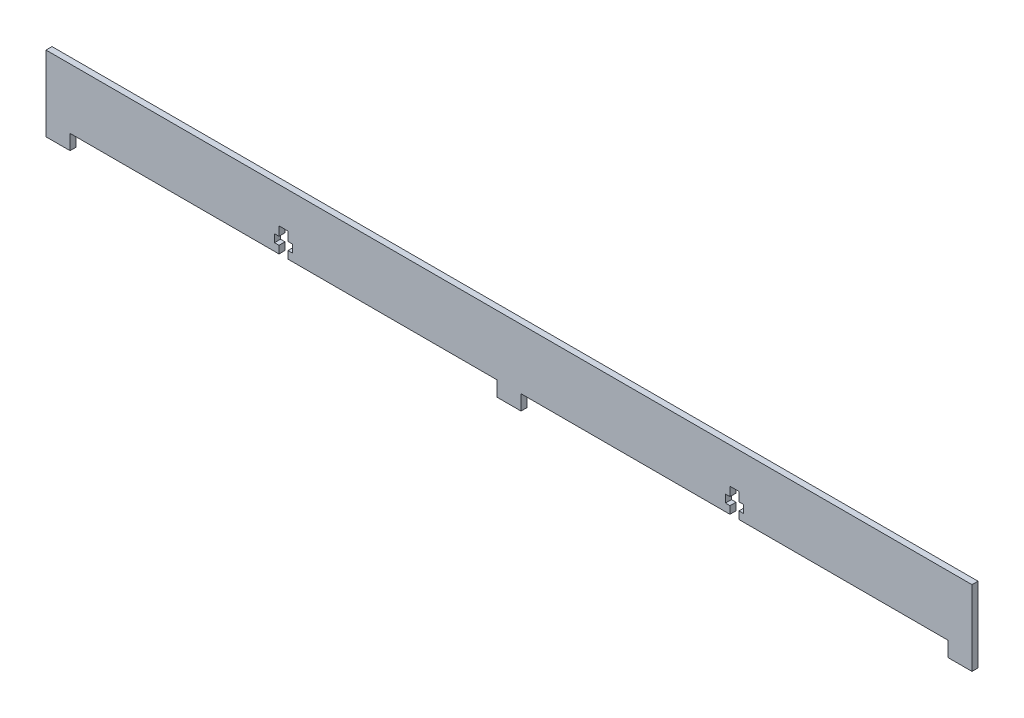
ISO-10303-21;
HEADER;
FILE_DESCRIPTION(('STEP AP214'),'2;1');
FILE_NAME('part.step','',(''),(''),'','','');
FILE_SCHEMA(('AUTOMOTIVE_DESIGN { 1 0 10303 214 1 1 1 1 }'));
ENDSEC;
DATA;
#1=APPLICATION_CONTEXT('core data for automotive mechanical design processes');
#2=APPLICATION_PROTOCOL_DEFINITION('international standard','automotive_design',2000,#1);
#3=PRODUCT_CONTEXT('',#1,'mechanical');
#4=PRODUCT('Part','Part','',(#3));
#5=PRODUCT_RELATED_PRODUCT_CATEGORY('part','',(#4));
#6=PRODUCT_DEFINITION_FORMATION('','',#4);
#7=PRODUCT_DEFINITION_CONTEXT('part definition',#1,'design');
#8=PRODUCT_DEFINITION('design','',#6,#7);
#9=PRODUCT_DEFINITION_SHAPE('','',#8);
#10=(LENGTH_UNIT() NAMED_UNIT(*) SI_UNIT(.MILLI.,.METRE.));
#11=(NAMED_UNIT(*) PLANE_ANGLE_UNIT() SI_UNIT($,.RADIAN.));
#12=(NAMED_UNIT(*) SI_UNIT($,.STERADIAN.) SOLID_ANGLE_UNIT());
#13=UNCERTAINTY_MEASURE_WITH_UNIT(LENGTH_MEASURE(1.E-05),#10,'distance_accuracy_value','');
#14=(GEOMETRIC_REPRESENTATION_CONTEXT(3) GLOBAL_UNCERTAINTY_ASSIGNED_CONTEXT((#13)) GLOBAL_UNIT_ASSIGNED_CONTEXT((#10,
#11,#12)) REPRESENTATION_CONTEXT('',''));
#15=CARTESIAN_POINT('',(0.,0.,0.));
#16=DIRECTION('',(0.,0.,1.));
#17=DIRECTION('',(1.,0.,0.));
#18=AXIS2_PLACEMENT_3D('',#15,#16,#17);
#19=CARTESIAN_POINT('',(1.50000000000004,0.,2.));
#20=DIRECTION('',(1.,0.,0.));
#21=DIRECTION('',(0.,1.,0.));
#22=AXIS2_PLACEMENT_3D('',#19,#20,#21);
#23=PLANE('',#22);
#24=DIRECTION('',(0.,-1.,0.));
#25=VECTOR('',#24,1.);
#26=CARTESIAN_POINT('',(1.50000000000004,0.,0.));
#27=LINE('',#26,#25);
#28=CARTESIAN_POINT('',(1.5,2.4999999999999,0.));
#29=VERTEX_POINT('',#28);
#30=CARTESIAN_POINT('',(1.50000000000004,-1.05818134681562E-13,0.));
#31=VERTEX_POINT('',#30);
#32=EDGE_CURVE('E300',#29,#31,#27,.T.);
#33=ORIENTED_EDGE('',*,*,#32,.T.);
#34=DIRECTION('',(0.,0.,-1.));
#35=VECTOR('',#34,1.);
#36=CARTESIAN_POINT('',(1.50000000000004,-1.05818134681562E-13,2.));
#37=LINE('',#36,#35);
#38=CARTESIAN_POINT('',(1.50000000000004,-1.05818134681562E-13,2.));
#39=VERTEX_POINT('',#38);
#40=EDGE_CURVE('E11',#39,#31,#37,.T.);
#41=ORIENTED_EDGE('',*,*,#40,.F.);
#42=DIRECTION('',(0.,-1.,0.));
#43=VECTOR('',#42,1.);
#44=CARTESIAN_POINT('',(1.50000000000004,0.,2.));
#45=LINE('',#44,#43);
#46=CARTESIAN_POINT('',(1.5,2.4999999999999,2.));
#47=VERTEX_POINT('',#46);
#48=EDGE_CURVE('E392',#47,#39,#45,.T.);
#49=ORIENTED_EDGE('',*,*,#48,.F.);
#50=DIRECTION('',(0.,0.,-1.));
#51=VECTOR('',#50,1.);
#52=CARTESIAN_POINT('',(1.5,2.4999999999999,2.));
#53=LINE('',#52,#51);
#54=EDGE_CURVE('E51',#47,#29,#53,.T.);
#55=ORIENTED_EDGE('',*,*,#54,.T.);
#56=EDGE_LOOP('',(#33,#41,#49,#55));
#57=FACE_BOUND('',#56,.T.);
#58=ADVANCED_FACE('F35',(#57),#23,.F.);
#59=CARTESIAN_POINT('',(0.,0.,2.));
#60=DIRECTION('',(0.,1.,0.));
#61=DIRECTION('',(-1.,0.,0.));
#62=AXIS2_PLACEMENT_3D('',#59,#60,#61);
#63=PLANE('',#62);
#64=DIRECTION('',(1.,0.,0.));
#65=VECTOR('',#64,1.);
#66=CARTESIAN_POINT('',(0.,0.,0.));
#67=LINE('',#66,#65);
#68=CARTESIAN_POINT('',(71.,0.,0.));
#69=VERTEX_POINT('',#68);
#70=EDGE_CURVE('E302',#31,#69,#67,.T.);
#71=ORIENTED_EDGE('',*,*,#70,.T.);
#72=DIRECTION('',(0.,0.,-1.));
#73=VECTOR('',#72,1.);
#74=CARTESIAN_POINT('',(71.,0.,2.));
#75=LINE('',#74,#73);
#76=CARTESIAN_POINT('',(71.,0.,2.));
#77=VERTEX_POINT('',#76);
#78=EDGE_CURVE('E43',#77,#69,#75,.T.);
#79=ORIENTED_EDGE('',*,*,#78,.F.);
#80=DIRECTION('',(1.,0.,0.));
#81=VECTOR('',#80,1.);
#82=CARTESIAN_POINT('',(0.,0.,2.));
#83=LINE('',#82,#81);
#84=EDGE_CURVE('E173',#39,#77,#83,.T.);
#85=ORIENTED_EDGE('',*,*,#84,.F.);
#86=ORIENTED_EDGE('',*,*,#40,.T.);
#87=EDGE_LOOP('',(#71,#79,#85,#86));
#88=FACE_BOUND('',#87,.T.);
#89=ADVANCED_FACE('F570',(#88),#63,.F.);
#90=CARTESIAN_POINT('',(71.,0.,2.));
#91=DIRECTION('',(1.,0.,0.));
#92=DIRECTION('',(0.,0.,-1.));
#93=AXIS2_PLACEMENT_3D('',#90,#91,#92);
#94=PLANE('',#93);
#95=DIRECTION('',(0.,-1.,0.));
#96=VECTOR('',#95,1.);
#97=CARTESIAN_POINT('',(71.,0.,0.));
#98=LINE('',#97,#96);
#99=CARTESIAN_POINT('',(71.,-5.00000000000001,0.));
#100=VERTEX_POINT('',#99);
#101=EDGE_CURVE('E304',#69,#100,#98,.T.);
#102=ORIENTED_EDGE('',*,*,#101,.T.);
#103=DIRECTION('',(0.,0.,-1.));
#104=VECTOR('',#103,1.);
#105=CARTESIAN_POINT('',(71.,-5.00000000000001,2.));
#106=LINE('',#105,#104);
#107=CARTESIAN_POINT('',(71.,-5.00000000000001,2.));
#108=VERTEX_POINT('',#107);
#109=EDGE_CURVE('E465',#108,#100,#106,.T.);
#110=ORIENTED_EDGE('',*,*,#109,.F.);
#111=DIRECTION('',(0.,-1.,0.));
#112=VECTOR('',#111,1.);
#113=CARTESIAN_POINT('',(71.,0.,2.));
#114=LINE('',#113,#112);
#115=EDGE_CURVE('E472',#77,#108,#114,.T.);
#116=ORIENTED_EDGE('',*,*,#115,.F.);
#117=ORIENTED_EDGE('',*,*,#78,.T.);
#118=EDGE_LOOP('',(#102,#110,#116,#117));
#119=FACE_BOUND('',#118,.T.);
#120=ADVANCED_FACE('F470',(#119),#94,.F.);
#121=CARTESIAN_POINT('',(0.,-5.00000000000001,2.));
#122=DIRECTION('',(0.,-1.,0.));
#123=DIRECTION('',(0.,0.,-1.));
#124=AXIS2_PLACEMENT_3D('',#121,#122,#123);
#125=PLANE('',#124);
#126=DIRECTION('',(-1.,0.,0.));
#127=VECTOR('',#126,1.);
#128=CARTESIAN_POINT('',(0.,-5.00000000000001,0.));
#129=LINE('',#128,#127);
#130=CARTESIAN_POINT('',(79.,-5.00000000000001,0.));
#131=VERTEX_POINT('',#130);
#132=EDGE_CURVE('E307',#131,#100,#129,.T.);
#133=ORIENTED_EDGE('',*,*,#132,.F.);
#134=DIRECTION('',(0.,0.,-1.));
#135=VECTOR('',#134,1.);
#136=CARTESIAN_POINT('',(79.,-5.00000000000001,2.));
#137=LINE('',#136,#135);
#138=CARTESIAN_POINT('',(79.,-5.00000000000001,2.));
#139=VERTEX_POINT('',#138);
#140=EDGE_CURVE('E463',#139,#131,#137,.T.);
#141=ORIENTED_EDGE('',*,*,#140,.F.);
#142=DIRECTION('',(-1.,0.,0.));
#143=VECTOR('',#142,1.);
#144=CARTESIAN_POINT('',(0.,-5.00000000000001,2.));
#145=LINE('',#144,#143);
#146=EDGE_CURVE('E483',#139,#108,#145,.T.);
#147=ORIENTED_EDGE('',*,*,#146,.T.);
#148=ORIENTED_EDGE('',*,*,#109,.T.);
#149=EDGE_LOOP('',(#133,#141,#147,#148));
#150=FACE_BOUND('',#149,.T.);
#151=ADVANCED_FACE('F479',(#150),#125,.T.);
#152=CARTESIAN_POINT('',(79.,0.,2.));
#153=DIRECTION('',(-1.,0.,0.));
#154=DIRECTION('',(0.,0.,1.));
#155=AXIS2_PLACEMENT_3D('',#152,#153,#154);
#156=PLANE('',#155);
#157=DIRECTION('',(0.,1.,0.));
#158=VECTOR('',#157,1.);
#159=CARTESIAN_POINT('',(79.,0.,0.));
#160=LINE('',#159,#158);
#161=CARTESIAN_POINT('',(79.,20.,0.));
#162=VERTEX_POINT('',#161);
#163=EDGE_CURVE('E310',#131,#162,#160,.T.);
#164=ORIENTED_EDGE('',*,*,#163,.T.);
#165=DIRECTION('',(0.,0.,-1.));
#166=VECTOR('',#165,1.);
#167=CARTESIAN_POINT('',(79.,20.,2.));
#168=LINE('',#167,#166);
#169=CARTESIAN_POINT('',(79.,20.,2.));
#170=VERTEX_POINT('',#169);
#171=EDGE_CURVE('E460',#170,#162,#168,.T.);
#172=ORIENTED_EDGE('',*,*,#171,.F.);
#173=DIRECTION('',(0.,1.,0.));
#174=VECTOR('',#173,1.);
#175=CARTESIAN_POINT('',(79.,0.,2.));
#176=LINE('',#175,#174);
#177=EDGE_CURVE('E484',#139,#170,#176,.T.);
#178=ORIENTED_EDGE('',*,*,#177,.F.);
#179=ORIENTED_EDGE('',*,*,#140,.T.);
#180=EDGE_LOOP('',(#164,#172,#178,#179));
#181=FACE_BOUND('',#180,.T.);
#182=ADVANCED_FACE('F583',(#181),#156,.F.);
#183=CARTESIAN_POINT('',(0.,20.,2.));
#184=DIRECTION('',(0.,-1.,0.));
#185=DIRECTION('',(0.,0.,-1.));
#186=AXIS2_PLACEMENT_3D('',#183,#184,#185);
#187=PLANE('',#186);
#188=DIRECTION('',(-1.,0.,0.));
#189=VECTOR('',#188,1.);
#190=CARTESIAN_POINT('',(0.,20.,0.));
#191=LINE('',#190,#189);
#192=CARTESIAN_POINT('',(-229.,20.,0.));
#193=VERTEX_POINT('',#192);
#194=EDGE_CURVE('E312',#162,#193,#191,.T.);
#195=ORIENTED_EDGE('',*,*,#194,.T.);
#196=DIRECTION('',(0.,0.,-1.));
#197=VECTOR('',#196,1.);
#198=CARTESIAN_POINT('',(-229.,20.,2.));
#199=LINE('',#198,#197);
#200=CARTESIAN_POINT('',(-229.,20.,2.));
#201=VERTEX_POINT('',#200);
#202=EDGE_CURVE('E458',#201,#193,#199,.T.);
#203=ORIENTED_EDGE('',*,*,#202,.F.);
#204=DIRECTION('',(-1.,0.,0.));
#205=VECTOR('',#204,1.);
#206=CARTESIAN_POINT('',(0.,20.,2.));
#207=LINE('',#206,#205);
#208=EDGE_CURVE('E486',#170,#201,#207,.T.);
#209=ORIENTED_EDGE('',*,*,#208,.F.);
#210=ORIENTED_EDGE('',*,*,#171,.T.);
#211=EDGE_LOOP('',(#195,#203,#209,#210));
#212=FACE_BOUND('',#211,.T.);
#213=ADVANCED_FACE('F586',(#212),#187,.F.);
#214=CARTESIAN_POINT('',(-229.,0.,2.));
#215=DIRECTION('',(-1.,0.,0.));
#216=DIRECTION('',(0.,0.,1.));
#217=AXIS2_PLACEMENT_3D('',#214,#215,#216);
#218=PLANE('',#217);
#219=DIRECTION('',(0.,1.,0.));
#220=VECTOR('',#219,1.);
#221=CARTESIAN_POINT('',(-229.,0.,0.));
#222=LINE('',#221,#220);
#223=CARTESIAN_POINT('',(-229.,-5.00000000000001,0.));
#224=VERTEX_POINT('',#223);
#225=EDGE_CURVE('E315',#224,#193,#222,.T.);
#226=ORIENTED_EDGE('',*,*,#225,.F.);
#227=DIRECTION('',(0.,0.,-1.));
#228=VECTOR('',#227,1.);
#229=CARTESIAN_POINT('',(-229.,-5.00000000000001,2.));
#230=LINE('',#229,#228);
#231=CARTESIAN_POINT('',(-229.,-5.00000000000001,2.));
#232=VERTEX_POINT('',#231);
#233=EDGE_CURVE('E456',#232,#224,#230,.T.);
#234=ORIENTED_EDGE('',*,*,#233,.F.);
#235=DIRECTION('',(0.,1.,0.));
#236=VECTOR('',#235,1.);
#237=CARTESIAN_POINT('',(-229.,0.,2.));
#238=LINE('',#237,#236);
#239=EDGE_CURVE('E492',#232,#201,#238,.T.);
#240=ORIENTED_EDGE('',*,*,#239,.T.);
#241=ORIENTED_EDGE('',*,*,#202,.T.);
#242=EDGE_LOOP('',(#226,#234,#240,#241));
#243=FACE_BOUND('',#242,.T.);
#244=ADVANCED_FACE('F590',(#243),#218,.T.);
#245=CARTESIAN_POINT('',(0.,-5.00000000000001,2.));
#246=DIRECTION('',(0.,1.,0.));
#247=DIRECTION('',(0.,0.,1.));
#248=AXIS2_PLACEMENT_3D('',#245,#246,#247);
#249=PLANE('',#248);
#250=DIRECTION('',(1.,0.,0.));
#251=VECTOR('',#250,1.);
#252=CARTESIAN_POINT('',(0.,-5.00000000000001,0.));
#253=LINE('',#252,#251);
#254=CARTESIAN_POINT('',(-221.,-5.00000000000001,0.));
#255=VERTEX_POINT('',#254);
#256=EDGE_CURVE('E318',#224,#255,#253,.T.);
#257=ORIENTED_EDGE('',*,*,#256,.T.);
#258=DIRECTION('',(0.,0.,-1.));
#259=VECTOR('',#258,1.);
#260=CARTESIAN_POINT('',(-221.,-5.00000000000001,2.));
#261=LINE('',#260,#259);
#262=CARTESIAN_POINT('',(-221.,-5.00000000000001,2.));
#263=VERTEX_POINT('',#262);
#264=EDGE_CURVE('E454',#263,#255,#261,.T.);
#265=ORIENTED_EDGE('',*,*,#264,.F.);
#266=DIRECTION('',(1.,0.,0.));
#267=VECTOR('',#266,1.);
#268=CARTESIAN_POINT('',(0.,-5.00000000000001,2.));
#269=LINE('',#268,#267);
#270=EDGE_CURVE('E495',#232,#263,#269,.T.);
#271=ORIENTED_EDGE('',*,*,#270,.F.);
#272=ORIENTED_EDGE('',*,*,#233,.T.);
#273=EDGE_LOOP('',(#257,#265,#271,#272));
#274=FACE_BOUND('',#273,.T.);
#275=ADVANCED_FACE('F594',(#274),#249,.F.);
#276=CARTESIAN_POINT('',(-221.,-1.22679644221079E-12,2.));
#277=DIRECTION('',(1.,0.,0.));
#278=DIRECTION('',(0.,1.,0.));
#279=AXIS2_PLACEMENT_3D('',#276,#277,#278);
#280=PLANE('',#279);
#281=DIRECTION('',(0.,-1.,0.));
#282=VECTOR('',#281,1.);
#283=CARTESIAN_POINT('',(-221.,-1.22679644221079E-12,0.));
#284=LINE('',#283,#282);
#285=CARTESIAN_POINT('',(-221.,0.,0.));
#286=VERTEX_POINT('',#285);
#287=EDGE_CURVE('E321',#286,#255,#284,.T.);
#288=ORIENTED_EDGE('',*,*,#287,.F.);
#289=DIRECTION('',(0.,0.,-1.));
#290=VECTOR('',#289,1.);
#291=CARTESIAN_POINT('',(-221.,0.,2.));
#292=LINE('',#291,#290);
#293=CARTESIAN_POINT('',(-221.,0.,2.));
#294=VERTEX_POINT('',#293);
#295=EDGE_CURVE('E452',#294,#286,#292,.T.);
#296=ORIENTED_EDGE('',*,*,#295,.F.);
#297=DIRECTION('',(0.,-1.,0.));
#298=VECTOR('',#297,1.);
#299=CARTESIAN_POINT('',(-221.,-1.22679644221079E-12,2.));
#300=LINE('',#299,#298);
#301=EDGE_CURVE('E497',#294,#263,#300,.T.);
#302=ORIENTED_EDGE('',*,*,#301,.T.);
#303=ORIENTED_EDGE('',*,*,#264,.T.);
#304=EDGE_LOOP('',(#288,#296,#302,#303));
#305=FACE_BOUND('',#304,.T.);
#306=ADVANCED_FACE('F598',(#305),#280,.T.);
#307=CARTESIAN_POINT('',(0.,0.,2.));
#308=DIRECTION('',(0.,-1.,0.));
#309=DIRECTION('',(1.,0.,0.));
#310=AXIS2_PLACEMENT_3D('',#307,#308,#309);
#311=PLANE('',#310);
#312=DIRECTION('',(-1.,0.,0.));
#313=VECTOR('',#312,1.);
#314=CARTESIAN_POINT('',(0.,0.,0.));
#315=LINE('',#314,#313);
#316=CARTESIAN_POINT('',(-151.5,3.18842173561048E-13,0.));
#317=VERTEX_POINT('',#316);
#318=EDGE_CURVE('E324',#317,#286,#315,.T.);
#319=ORIENTED_EDGE('',*,*,#318,.F.);
#320=DIRECTION('',(0.,0.,-1.));
#321=VECTOR('',#320,1.);
#322=CARTESIAN_POINT('',(-151.5,3.18842173561048E-13,2.));
#323=LINE('',#322,#321);
#324=CARTESIAN_POINT('',(-151.5,3.18842173561048E-13,2.));
#325=VERTEX_POINT('',#324);
#326=EDGE_CURVE('E450',#325,#317,#323,.T.);
#327=ORIENTED_EDGE('',*,*,#326,.F.);
#328=DIRECTION('',(-1.,0.,0.));
#329=VECTOR('',#328,1.);
#330=CARTESIAN_POINT('',(0.,0.,2.));
#331=LINE('',#330,#329);
#332=EDGE_CURVE('E500',#325,#294,#331,.T.);
#333=ORIENTED_EDGE('',*,*,#332,.T.);
#334=ORIENTED_EDGE('',*,*,#295,.T.);
#335=EDGE_LOOP('',(#319,#327,#333,#334));
#336=FACE_BOUND('',#335,.T.);
#337=ADVANCED_FACE('F602',(#336),#311,.T.);
#338=CARTESIAN_POINT('',(-151.5,0.,2.));
#339=DIRECTION('',(-1.,0.,0.));
#340=DIRECTION('',(0.,0.,1.));
#341=AXIS2_PLACEMENT_3D('',#338,#339,#340);
#342=PLANE('',#341);
#343=DIRECTION('',(0.,1.,0.));
#344=VECTOR('',#343,1.);
#345=CARTESIAN_POINT('',(-151.5,0.,0.));
#346=LINE('',#345,#344);
#347=CARTESIAN_POINT('',(-151.5,2.4999999999999,0.));
#348=VERTEX_POINT('',#347);
#349=EDGE_CURVE('E327',#317,#348,#346,.T.);
#350=ORIENTED_EDGE('',*,*,#349,.T.);
#351=DIRECTION('',(0.,0.,-1.));
#352=VECTOR('',#351,1.);
#353=CARTESIAN_POINT('',(-151.5,2.4999999999999,2.));
#354=LINE('',#353,#352);
#355=CARTESIAN_POINT('',(-151.5,2.4999999999999,2.));
#356=VERTEX_POINT('',#355);
#357=EDGE_CURVE('E447',#356,#348,#354,.T.);
#358=ORIENTED_EDGE('',*,*,#357,.F.);
#359=DIRECTION('',(0.,1.,0.));
#360=VECTOR('',#359,1.);
#361=CARTESIAN_POINT('',(-151.5,0.,2.));
#362=LINE('',#361,#360);
#363=EDGE_CURVE('E503',#325,#356,#362,.T.);
#364=ORIENTED_EDGE('',*,*,#363,.F.);
#365=ORIENTED_EDGE('',*,*,#326,.T.);
#366=EDGE_LOOP('',(#350,#358,#364,#365));
#367=FACE_BOUND('',#366,.T.);
#368=ADVANCED_FACE('F606',(#367),#342,.F.);
#369=CARTESIAN_POINT('',(0.,2.49999999999911,2.));
#370=DIRECTION('',(0.,-1.,0.));
#371=DIRECTION('',(1.,0.,0.));
#372=AXIS2_PLACEMENT_3D('',#369,#370,#371);
#373=PLANE('',#372);
#374=DIRECTION('',(-1.,0.,0.));
#375=VECTOR('',#374,1.);
#376=CARTESIAN_POINT('',(0.,2.49999999999911,0.));
#377=LINE('',#376,#375);
#378=CARTESIAN_POINT('',(-153.,2.4999999999999,0.));
#379=VERTEX_POINT('',#378);
#380=EDGE_CURVE('E329',#348,#379,#377,.T.);
#381=ORIENTED_EDGE('',*,*,#380,.T.);
#382=DIRECTION('',(0.,0.,-1.));
#383=VECTOR('',#382,1.);
#384=CARTESIAN_POINT('',(-153.,2.4999999999999,2.));
#385=LINE('',#384,#383);
#386=CARTESIAN_POINT('',(-153.,2.4999999999999,2.));
#387=VERTEX_POINT('',#386);
#388=EDGE_CURVE('E444',#387,#379,#385,.T.);
#389=ORIENTED_EDGE('',*,*,#388,.F.);
#390=DIRECTION('',(-1.,0.,0.));
#391=VECTOR('',#390,1.);
#392=CARTESIAN_POINT('',(0.,2.49999999999911,2.));
#393=LINE('',#392,#391);
#394=EDGE_CURVE('E505',#356,#387,#393,.T.);
#395=ORIENTED_EDGE('',*,*,#394,.F.);
#396=ORIENTED_EDGE('',*,*,#357,.T.);
#397=EDGE_LOOP('',(#381,#389,#395,#396));
#398=FACE_BOUND('',#397,.T.);
#399=ADVANCED_FACE('F610',(#398),#373,.F.);
#400=CARTESIAN_POINT('',(-153.,1.63330887276537E-12,2.));
#401=DIRECTION('',(-1.,0.,0.));
#402=DIRECTION('',(0.,-1.,0.));
#403=AXIS2_PLACEMENT_3D('',#400,#401,#402);
#404=PLANE('',#403);
#405=DIRECTION('',(0.,1.,0.));
#406=VECTOR('',#405,1.);
#407=CARTESIAN_POINT('',(-153.,1.63330887276537E-12,0.));
#408=LINE('',#407,#406);
#409=CARTESIAN_POINT('',(-153.,5.10000000000068,0.));
#410=VERTEX_POINT('',#409);
#411=EDGE_CURVE('E331',#379,#410,#408,.T.);
#412=ORIENTED_EDGE('',*,*,#411,.T.);
#413=DIRECTION('',(0.,0.,-1.));
#414=VECTOR('',#413,1.);
#415=CARTESIAN_POINT('',(-153.,5.10000000000068,2.));
#416=LINE('',#415,#414);
#417=CARTESIAN_POINT('',(-153.,5.10000000000068,2.));
#418=VERTEX_POINT('',#417);
#419=EDGE_CURVE('E441',#418,#410,#416,.T.);
#420=ORIENTED_EDGE('',*,*,#419,.F.);
#421=DIRECTION('',(0.,1.,0.));
#422=VECTOR('',#421,1.);
#423=CARTESIAN_POINT('',(-153.,1.63330887276537E-12,2.));
#424=LINE('',#423,#422);
#425=EDGE_CURVE('E507',#387,#418,#424,.T.);
#426=ORIENTED_EDGE('',*,*,#425,.F.);
#427=ORIENTED_EDGE('',*,*,#388,.T.);
#428=EDGE_LOOP('',(#412,#420,#426,#427));
#429=FACE_BOUND('',#428,.T.);
#430=ADVANCED_FACE('F614',(#429),#404,.F.);
#431=CARTESIAN_POINT('',(0.,5.0999999999998,2.));
#432=DIRECTION('',(0.,1.,0.));
#433=DIRECTION('',(-1.,0.,0.));
#434=AXIS2_PLACEMENT_3D('',#431,#432,#433);
#435=PLANE('',#434);
#436=DIRECTION('',(1.,0.,0.));
#437=VECTOR('',#436,1.);
#438=CARTESIAN_POINT('',(0.,5.0999999999998,0.));
#439=LINE('',#438,#437);
#440=CARTESIAN_POINT('',(-151.499999999986,5.10000000000067,0.));
#441=VERTEX_POINT('',#440);
#442=EDGE_CURVE('E333',#410,#441,#439,.T.);
#443=ORIENTED_EDGE('',*,*,#442,.T.);
#444=DIRECTION('',(0.,0.,-1.));
#445=VECTOR('',#444,1.);
#446=CARTESIAN_POINT('',(-151.499999999986,5.10000000000067,2.));
#447=LINE('',#446,#445);
#448=CARTESIAN_POINT('',(-151.499999999986,5.10000000000067,2.));
#449=VERTEX_POINT('',#448);
#450=EDGE_CURVE('E438',#449,#441,#447,.T.);
#451=ORIENTED_EDGE('',*,*,#450,.F.);
#452=DIRECTION('',(1.,0.,0.));
#453=VECTOR('',#452,1.);
#454=CARTESIAN_POINT('',(0.,5.0999999999998,2.));
#455=LINE('',#454,#453);
#456=EDGE_CURVE('E509',#418,#449,#455,.T.);
#457=ORIENTED_EDGE('',*,*,#456,.F.);
#458=ORIENTED_EDGE('',*,*,#419,.T.);
#459=EDGE_LOOP('',(#443,#451,#457,#458));
#460=FACE_BOUND('',#459,.T.);
#461=ADVANCED_FACE('F618',(#460),#435,.F.);
#462=CARTESIAN_POINT('',(-151.499999999986,1.40165656858931E-12,2.));
#463=DIRECTION('',(-1.,0.,0.));
#464=DIRECTION('',(0.,-1.,0.));
#465=AXIS2_PLACEMENT_3D('',#462,#463,#464);
#466=PLANE('',#465);
#467=DIRECTION('',(0.,1.,0.));
#468=VECTOR('',#467,1.);
#469=CARTESIAN_POINT('',(-151.499999999986,1.40165656858931E-12,0.));
#470=LINE('',#469,#468);
#471=CARTESIAN_POINT('',(-151.499999999986,8.10000000000027,0.));
#472=VERTEX_POINT('',#471);
#473=EDGE_CURVE('E335',#441,#472,#470,.T.);
#474=ORIENTED_EDGE('',*,*,#473,.T.);
#475=DIRECTION('',(0.,0.,-1.));
#476=VECTOR('',#475,1.);
#477=CARTESIAN_POINT('',(-151.499999999986,8.10000000000027,2.));
#478=LINE('',#477,#476);
#479=CARTESIAN_POINT('',(-151.499999999986,8.10000000000027,2.));
#480=VERTEX_POINT('',#479);
#481=EDGE_CURVE('E435',#480,#472,#478,.T.);
#482=ORIENTED_EDGE('',*,*,#481,.F.);
#483=DIRECTION('',(0.,1.,0.));
#484=VECTOR('',#483,1.);
#485=CARTESIAN_POINT('',(-151.499999999986,1.40165656858931E-12,2.));
#486=LINE('',#485,#484);
#487=EDGE_CURVE('E511',#449,#480,#486,.T.);
#488=ORIENTED_EDGE('',*,*,#487,.F.);
#489=ORIENTED_EDGE('',*,*,#450,.T.);
#490=EDGE_LOOP('',(#474,#482,#488,#489));
#491=FACE_BOUND('',#490,.T.);
#492=ADVANCED_FACE('F622',(#491),#466,.F.);
#493=CARTESIAN_POINT('',(0.,8.09999999999958,2.));
#494=DIRECTION('',(0.,1.,0.));
#495=DIRECTION('',(-1.,0.,0.));
#496=AXIS2_PLACEMENT_3D('',#493,#494,#495);
#497=PLANE('',#496);
#498=DIRECTION('',(1.,0.,0.));
#499=VECTOR('',#498,1.);
#500=CARTESIAN_POINT('',(0.,8.09999999999958,0.));
#501=LINE('',#500,#499);
#502=CARTESIAN_POINT('',(-148.500000000014,8.10000000000026,0.));
#503=VERTEX_POINT('',#502);
#504=EDGE_CURVE('E337',#472,#503,#501,.T.);
#505=ORIENTED_EDGE('',*,*,#504,.T.);
#506=DIRECTION('',(0.,0.,-1.));
#507=VECTOR('',#506,1.);
#508=CARTESIAN_POINT('',(-148.500000000014,8.10000000000026,2.));
#509=LINE('',#508,#507);
#510=CARTESIAN_POINT('',(-148.500000000014,8.10000000000026,2.));
#511=VERTEX_POINT('',#510);
#512=EDGE_CURVE('E433',#511,#503,#509,.T.);
#513=ORIENTED_EDGE('',*,*,#512,.F.);
#514=DIRECTION('',(1.,0.,0.));
#515=VECTOR('',#514,1.);
#516=CARTESIAN_POINT('',(0.,8.09999999999958,2.));
#517=LINE('',#516,#515);
#518=EDGE_CURVE('E513',#480,#511,#517,.T.);
#519=ORIENTED_EDGE('',*,*,#518,.F.);
#520=ORIENTED_EDGE('',*,*,#481,.T.);
#521=EDGE_LOOP('',(#505,#513,#519,#520));
#522=FACE_BOUND('',#521,.T.);
#523=ADVANCED_FACE('F626',(#522),#497,.F.);
#524=CARTESIAN_POINT('',(-148.500000000014,1.37390099297353E-12,2.));
#525=DIRECTION('',(-1.,0.,0.));
#526=DIRECTION('',(0.,-1.,0.));
#527=AXIS2_PLACEMENT_3D('',#524,#525,#526);
#528=PLANE('',#527);
#529=DIRECTION('',(0.,1.,0.));
#530=VECTOR('',#529,1.);
#531=CARTESIAN_POINT('',(-148.500000000014,1.37390099297353E-12,0.));
#532=LINE('',#531,#530);
#533=CARTESIAN_POINT('',(-148.500000000014,5.09999999999977,0.));
#534=VERTEX_POINT('',#533);
#535=EDGE_CURVE('E340',#534,#503,#532,.T.);
#536=ORIENTED_EDGE('',*,*,#535,.F.);
#537=DIRECTION('',(0.,0.,-1.));
#538=VECTOR('',#537,1.);
#539=CARTESIAN_POINT('',(-148.500000000014,5.09999999999977,2.));
#540=LINE('',#539,#538);
#541=CARTESIAN_POINT('',(-148.500000000014,5.09999999999977,2.));
#542=VERTEX_POINT('',#541);
#543=EDGE_CURVE('E431',#542,#534,#540,.T.);
#544=ORIENTED_EDGE('',*,*,#543,.F.);
#545=DIRECTION('',(0.,1.,0.));
#546=VECTOR('',#545,1.);
#547=CARTESIAN_POINT('',(-148.500000000014,1.37390099297353E-12,2.));
#548=LINE('',#547,#546);
#549=EDGE_CURVE('E515',#542,#511,#548,.T.);
#550=ORIENTED_EDGE('',*,*,#549,.T.);
#551=ORIENTED_EDGE('',*,*,#512,.T.);
#552=EDGE_LOOP('',(#536,#544,#550,#551));
#553=FACE_BOUND('',#552,.T.);
#554=ADVANCED_FACE('F630',(#553),#528,.T.);
#555=CARTESIAN_POINT('',(0.,5.09999999999891,2.));
#556=DIRECTION('',(0.,-1.,0.));
#557=DIRECTION('',(1.,0.,0.));
#558=AXIS2_PLACEMENT_3D('',#555,#556,#557);
#559=PLANE('',#558);
#560=DIRECTION('',(-1.,0.,0.));
#561=VECTOR('',#560,1.);
#562=CARTESIAN_POINT('',(0.,5.09999999999891,0.));
#563=LINE('',#562,#561);
#564=CARTESIAN_POINT('',(-147.,5.09999999999976,0.));
#565=VERTEX_POINT('',#564);
#566=EDGE_CURVE('E343',#565,#534,#563,.T.);
#567=ORIENTED_EDGE('',*,*,#566,.F.);
#568=DIRECTION('',(0.,0.,-1.));
#569=VECTOR('',#568,1.);
#570=CARTESIAN_POINT('',(-147.,5.09999999999976,2.));
#571=LINE('',#570,#569);
#572=CARTESIAN_POINT('',(-147.,5.09999999999976,2.));
#573=VERTEX_POINT('',#572);
#574=EDGE_CURVE('E429',#573,#565,#571,.T.);
#575=ORIENTED_EDGE('',*,*,#574,.F.);
#576=DIRECTION('',(-1.,0.,0.));
#577=VECTOR('',#576,1.);
#578=CARTESIAN_POINT('',(0.,5.09999999999891,2.));
#579=LINE('',#578,#577);
#580=EDGE_CURVE('E518',#573,#542,#579,.T.);
#581=ORIENTED_EDGE('',*,*,#580,.T.);
#582=ORIENTED_EDGE('',*,*,#543,.T.);
#583=EDGE_LOOP('',(#567,#575,#581,#582));
#584=FACE_BOUND('',#583,.T.);
#585=ADVANCED_FACE('F634',(#584),#559,.T.);
#586=CARTESIAN_POINT('',(-147.,3.13851508884448E-12,2.));
#587=DIRECTION('',(-1.,0.,0.));
#588=DIRECTION('',(0.,-1.,0.));
#589=AXIS2_PLACEMENT_3D('',#586,#587,#588);
#590=PLANE('',#589);
#591=DIRECTION('',(0.,1.,0.));
#592=VECTOR('',#591,1.);
#593=CARTESIAN_POINT('',(-147.,3.13851508884448E-12,0.));
#594=LINE('',#593,#592);
#595=CARTESIAN_POINT('',(-147.,2.49999999999999,0.));
#596=VERTEX_POINT('',#595);
#597=EDGE_CURVE('E346',#596,#565,#594,.T.);
#598=ORIENTED_EDGE('',*,*,#597,.F.);
#599=DIRECTION('',(0.,0.,-1.));
#600=VECTOR('',#599,1.);
#601=CARTESIAN_POINT('',(-147.,2.49999999999999,2.));
#602=LINE('',#601,#600);
#603=CARTESIAN_POINT('',(-147.,2.49999999999999,2.));
#604=VERTEX_POINT('',#603);
#605=EDGE_CURVE('E427',#604,#596,#602,.T.);
#606=ORIENTED_EDGE('',*,*,#605,.F.);
#607=DIRECTION('',(0.,1.,0.));
#608=VECTOR('',#607,1.);
#609=CARTESIAN_POINT('',(-147.,3.13851508884448E-12,2.));
#610=LINE('',#609,#608);
#611=EDGE_CURVE('E521',#604,#573,#610,.T.);
#612=ORIENTED_EDGE('',*,*,#611,.T.);
#613=ORIENTED_EDGE('',*,*,#574,.T.);
#614=EDGE_LOOP('',(#598,#606,#612,#613));
#615=FACE_BOUND('',#614,.T.);
#616=ADVANCED_FACE('F638',(#615),#590,.T.);
#617=CARTESIAN_POINT('',(0.,2.49999999999871,2.));
#618=DIRECTION('',(0.,1.,0.));
#619=DIRECTION('',(-1.,0.,0.));
#620=AXIS2_PLACEMENT_3D('',#617,#618,#619);
#621=PLANE('',#620);
#622=DIRECTION('',(1.,0.,0.));
#623=VECTOR('',#622,1.);
#624=CARTESIAN_POINT('',(0.,2.49999999999871,0.));
#625=LINE('',#624,#623);
#626=CARTESIAN_POINT('',(-148.5,2.5,0.));
#627=VERTEX_POINT('',#626);
#628=EDGE_CURVE('E349',#627,#596,#625,.T.);
#629=ORIENTED_EDGE('',*,*,#628,.F.);
#630=DIRECTION('',(0.,0.,-1.));
#631=VECTOR('',#630,1.);
#632=CARTESIAN_POINT('',(-148.5,2.5,2.));
#633=LINE('',#632,#631);
#634=CARTESIAN_POINT('',(-148.5,2.5,2.));
#635=VERTEX_POINT('',#634);
#636=EDGE_CURVE('E425',#635,#627,#633,.T.);
#637=ORIENTED_EDGE('',*,*,#636,.F.);
#638=DIRECTION('',(1.,0.,0.));
#639=VECTOR('',#638,1.);
#640=CARTESIAN_POINT('',(0.,2.49999999999871,2.));
#641=LINE('',#640,#639);
#642=EDGE_CURVE('E524',#635,#604,#641,.T.);
#643=ORIENTED_EDGE('',*,*,#642,.T.);
#644=ORIENTED_EDGE('',*,*,#605,.T.);
#645=EDGE_LOOP('',(#629,#637,#643,#644));
#646=FACE_BOUND('',#645,.T.);
#647=ADVANCED_FACE('F642',(#646),#621,.T.);
#648=CARTESIAN_POINT('',(-148.5,0.,2.));
#649=DIRECTION('',(1.,0.,0.));
#650=DIRECTION('',(0.,0.,-1.));
#651=AXIS2_PLACEMENT_3D('',#648,#649,#650);
#652=PLANE('',#651);
#653=DIRECTION('',(0.,-1.,0.));
#654=VECTOR('',#653,1.);
#655=CARTESIAN_POINT('',(-148.5,0.,0.));
#656=LINE('',#655,#654);
#657=CARTESIAN_POINT('',(-148.5,6.03799833872494E-13,0.));
#658=VERTEX_POINT('',#657);
#659=EDGE_CURVE('E352',#627,#658,#656,.T.);
#660=ORIENTED_EDGE('',*,*,#659,.T.);
#661=DIRECTION('',(0.,0.,-1.));
#662=VECTOR('',#661,1.);
#663=CARTESIAN_POINT('',(-148.5,6.03799833872494E-13,2.));
#664=LINE('',#663,#662);
#665=CARTESIAN_POINT('',(-148.5,6.03799833872494E-13,2.));
#666=VERTEX_POINT('',#665);
#667=EDGE_CURVE('E422',#666,#658,#664,.T.);
#668=ORIENTED_EDGE('',*,*,#667,.F.);
#669=DIRECTION('',(0.,-1.,0.));
#670=VECTOR('',#669,1.);
#671=CARTESIAN_POINT('',(-148.5,0.,2.));
#672=LINE('',#671,#670);
#673=EDGE_CURVE('E527',#635,#666,#672,.T.);
#674=ORIENTED_EDGE('',*,*,#673,.F.);
#675=ORIENTED_EDGE('',*,*,#636,.T.);
#676=EDGE_LOOP('',(#660,#668,#674,#675));
#677=FACE_BOUND('',#676,.T.);
#678=ADVANCED_FACE('F646',(#677),#652,.F.);
#679=CARTESIAN_POINT('',(0.,0.,2.));
#680=DIRECTION('',(0.,1.,0.));
#681=DIRECTION('',(-1.,0.,0.));
#682=AXIS2_PLACEMENT_3D('',#679,#680,#681);
#683=PLANE('',#682);
#684=DIRECTION('',(1.,0.,0.));
#685=VECTOR('',#684,1.);
#686=CARTESIAN_POINT('',(0.,0.,0.));
#687=LINE('',#686,#685);
#688=CARTESIAN_POINT('',(-79.,3.21213379635872E-13,0.));
#689=VERTEX_POINT('',#688);
#690=EDGE_CURVE('E354',#658,#689,#687,.T.);
#691=ORIENTED_EDGE('',*,*,#690,.T.);
#692=DIRECTION('',(0.,0.,-1.));
#693=VECTOR('',#692,1.);
#694=CARTESIAN_POINT('',(-79.,3.21213379635872E-13,2.));
#695=LINE('',#694,#693);
#696=CARTESIAN_POINT('',(-79.,3.21213379635872E-13,2.));
#697=VERTEX_POINT('',#696);
#698=EDGE_CURVE('E419',#697,#689,#695,.T.);
#699=ORIENTED_EDGE('',*,*,#698,.F.);
#700=DIRECTION('',(1.,0.,0.));
#701=VECTOR('',#700,1.);
#702=CARTESIAN_POINT('',(0.,0.,2.));
#703=LINE('',#702,#701);
#704=EDGE_CURVE('E529',#666,#697,#703,.T.);
#705=ORIENTED_EDGE('',*,*,#704,.F.);
#706=ORIENTED_EDGE('',*,*,#667,.T.);
#707=EDGE_LOOP('',(#691,#699,#705,#706));
#708=FACE_BOUND('',#707,.T.);
#709=ADVANCED_FACE('F650',(#708),#683,.F.);
#710=CARTESIAN_POINT('',(-79.,2.19269047363467E-13,2.));
#711=DIRECTION('',(1.,0.,0.));
#712=DIRECTION('',(0.,1.,0.));
#713=AXIS2_PLACEMENT_3D('',#710,#711,#712);
#714=PLANE('',#713);
#715=DIRECTION('',(0.,-1.,0.));
#716=VECTOR('',#715,1.);
#717=CARTESIAN_POINT('',(-79.,2.19269047363467E-13,0.));
#718=LINE('',#717,#716);
#719=CARTESIAN_POINT('',(-79.,-5.00000000000001,0.));
#720=VERTEX_POINT('',#719);
#721=EDGE_CURVE('E356',#689,#720,#718,.T.);
#722=ORIENTED_EDGE('',*,*,#721,.T.);
#723=DIRECTION('',(0.,0.,-1.));
#724=VECTOR('',#723,1.);
#725=CARTESIAN_POINT('',(-79.,-5.00000000000001,2.));
#726=LINE('',#725,#724);
#727=CARTESIAN_POINT('',(-79.,-5.00000000000001,2.));
#728=VERTEX_POINT('',#727);
#729=EDGE_CURVE('E417',#728,#720,#726,.T.);
#730=ORIENTED_EDGE('',*,*,#729,.F.);
#731=DIRECTION('',(0.,-1.,0.));
#732=VECTOR('',#731,1.);
#733=CARTESIAN_POINT('',(-79.,2.19269047363467E-13,2.));
#734=LINE('',#733,#732);
#735=EDGE_CURVE('E531',#697,#728,#734,.T.);
#736=ORIENTED_EDGE('',*,*,#735,.F.);
#737=ORIENTED_EDGE('',*,*,#698,.T.);
#738=EDGE_LOOP('',(#722,#730,#736,#737));
#739=FACE_BOUND('',#738,.T.);
#740=ADVANCED_FACE('F654',(#739),#714,.F.);
#741=CARTESIAN_POINT('',(0.,-5.00000000000001,2.));
#742=DIRECTION('',(0.,-1.,0.));
#743=DIRECTION('',(0.,0.,-1.));
#744=AXIS2_PLACEMENT_3D('',#741,#742,#743);
#745=PLANE('',#744);
#746=DIRECTION('',(-1.,0.,0.));
#747=VECTOR('',#746,1.);
#748=CARTESIAN_POINT('',(0.,-5.00000000000001,0.));
#749=LINE('',#748,#747);
#750=CARTESIAN_POINT('',(-71.,-5.00000000000001,0.));
#751=VERTEX_POINT('',#750);
#752=EDGE_CURVE('E359',#751,#720,#749,.T.);
#753=ORIENTED_EDGE('',*,*,#752,.F.);
#754=DIRECTION('',(0.,0.,-1.));
#755=VECTOR('',#754,1.);
#756=CARTESIAN_POINT('',(-71.,-5.00000000000001,2.));
#757=LINE('',#756,#755);
#758=CARTESIAN_POINT('',(-71.,-5.00000000000001,2.));
#759=VERTEX_POINT('',#758);
#760=EDGE_CURVE('E415',#759,#751,#757,.T.);
#761=ORIENTED_EDGE('',*,*,#760,.F.);
#762=DIRECTION('',(-1.,0.,0.));
#763=VECTOR('',#762,1.);
#764=CARTESIAN_POINT('',(0.,-5.00000000000001,2.));
#765=LINE('',#764,#763);
#766=EDGE_CURVE('E533',#759,#728,#765,.T.);
#767=ORIENTED_EDGE('',*,*,#766,.T.);
#768=ORIENTED_EDGE('',*,*,#729,.T.);
#769=EDGE_LOOP('',(#753,#761,#767,#768));
#770=FACE_BOUND('',#769,.T.);
#771=ADVANCED_FACE('F658',(#770),#745,.T.);
#772=CARTESIAN_POINT('',(-71.,0.,2.));
#773=DIRECTION('',(1.,0.,0.));
#774=DIRECTION('',(0.,0.,-1.));
#775=AXIS2_PLACEMENT_3D('',#772,#773,#774);
#776=PLANE('',#775);
#777=DIRECTION('',(0.,-1.,0.));
#778=VECTOR('',#777,1.);
#779=CARTESIAN_POINT('',(-71.,0.,0.));
#780=LINE('',#779,#778);
#781=CARTESIAN_POINT('',(-71.,0.,0.));
#782=VERTEX_POINT('',#781);
#783=EDGE_CURVE('E362',#782,#751,#780,.T.);
#784=ORIENTED_EDGE('',*,*,#783,.F.);
#785=DIRECTION('',(0.,0.,-1.));
#786=VECTOR('',#785,1.);
#787=CARTESIAN_POINT('',(-71.,0.,2.));
#788=LINE('',#787,#786);
#789=CARTESIAN_POINT('',(-71.,0.,2.));
#790=VERTEX_POINT('',#789);
#791=EDGE_CURVE('E413',#790,#782,#788,.T.);
#792=ORIENTED_EDGE('',*,*,#791,.F.);
#793=DIRECTION('',(0.,-1.,0.));
#794=VECTOR('',#793,1.);
#795=CARTESIAN_POINT('',(-71.,0.,2.));
#796=LINE('',#795,#794);
#797=EDGE_CURVE('E536',#790,#759,#796,.T.);
#798=ORIENTED_EDGE('',*,*,#797,.T.);
#799=ORIENTED_EDGE('',*,*,#760,.T.);
#800=EDGE_LOOP('',(#784,#792,#798,#799));
#801=FACE_BOUND('',#800,.T.);
#802=ADVANCED_FACE('F662',(#801),#776,.T.);
#803=CARTESIAN_POINT('',(0.,0.,2.));
#804=DIRECTION('',(0.,-1.,0.));
#805=DIRECTION('',(1.,0.,0.));
#806=AXIS2_PLACEMENT_3D('',#803,#804,#805);
#807=PLANE('',#806);
#808=DIRECTION('',(-1.,0.,0.));
#809=VECTOR('',#808,1.);
#810=CARTESIAN_POINT('',(0.,0.,0.));
#811=LINE('',#810,#809);
#812=CARTESIAN_POINT('',(-1.50000000000003,0.,0.));
#813=VERTEX_POINT('',#812);
#814=EDGE_CURVE('E365',#813,#782,#811,.T.);
#815=ORIENTED_EDGE('',*,*,#814,.F.);
#816=DIRECTION('',(0.,0.,-1.));
#817=VECTOR('',#816,1.);
#818=CARTESIAN_POINT('',(-1.50000000000003,0.,2.));
#819=LINE('',#818,#817);
#820=CARTESIAN_POINT('',(-1.50000000000003,0.,2.));
#821=VERTEX_POINT('',#820);
#822=EDGE_CURVE('E411',#821,#813,#819,.T.);
#823=ORIENTED_EDGE('',*,*,#822,.F.);
#824=DIRECTION('',(-1.,0.,0.));
#825=VECTOR('',#824,1.);
#826=CARTESIAN_POINT('',(0.,0.,2.));
#827=LINE('',#826,#825);
#828=EDGE_CURVE('E539',#821,#790,#827,.T.);
#829=ORIENTED_EDGE('',*,*,#828,.T.);
#830=ORIENTED_EDGE('',*,*,#791,.T.);
#831=EDGE_LOOP('',(#815,#823,#829,#830));
#832=FACE_BOUND('',#831,.T.);
#833=ADVANCED_FACE('F666',(#832),#807,.T.);
#834=CARTESIAN_POINT('',(-1.50000000000003,0.,2.));
#835=DIRECTION('',(1.,0.,0.));
#836=DIRECTION('',(0.,1.,0.));
#837=AXIS2_PLACEMENT_3D('',#834,#835,#836);
#838=PLANE('',#837);
#839=DIRECTION('',(0.,-1.,0.));
#840=VECTOR('',#839,1.);
#841=CARTESIAN_POINT('',(-1.50000000000003,0.,0.));
#842=LINE('',#841,#840);
#843=CARTESIAN_POINT('',(-1.50000000000006,2.5,0.));
#844=VERTEX_POINT('',#843);
#845=EDGE_CURVE('E368',#844,#813,#842,.T.);
#846=ORIENTED_EDGE('',*,*,#845,.F.);
#847=DIRECTION('',(0.,0.,-1.));
#848=VECTOR('',#847,1.);
#849=CARTESIAN_POINT('',(-1.50000000000006,2.5,2.));
#850=LINE('',#849,#848);
#851=CARTESIAN_POINT('',(-1.50000000000006,2.5,2.));
#852=VERTEX_POINT('',#851);
#853=EDGE_CURVE('E409',#852,#844,#850,.T.);
#854=ORIENTED_EDGE('',*,*,#853,.F.);
#855=DIRECTION('',(0.,-1.,0.));
#856=VECTOR('',#855,1.);
#857=CARTESIAN_POINT('',(-1.50000000000003,0.,2.));
#858=LINE('',#857,#856);
#859=EDGE_CURVE('E542',#852,#821,#858,.T.);
#860=ORIENTED_EDGE('',*,*,#859,.T.);
#861=ORIENTED_EDGE('',*,*,#822,.T.);
#862=EDGE_LOOP('',(#846,#854,#860,#861));
#863=FACE_BOUND('',#862,.T.);
#864=ADVANCED_FACE('F670',(#863),#838,.T.);
#865=CARTESIAN_POINT('',(0.,2.50000000000002,2.));
#866=DIRECTION('',(0.,-1.,0.));
#867=DIRECTION('',(1.,0.,0.));
#868=AXIS2_PLACEMENT_3D('',#865,#866,#867);
#869=PLANE('',#868);
#870=DIRECTION('',(-1.,0.,0.));
#871=VECTOR('',#870,1.);
#872=CARTESIAN_POINT('',(0.,2.50000000000002,0.));
#873=LINE('',#872,#871);
#874=CARTESIAN_POINT('',(-2.99999999999973,2.49999999999999,0.));
#875=VERTEX_POINT('',#874);
#876=EDGE_CURVE('E371',#844,#875,#873,.T.);
#877=ORIENTED_EDGE('',*,*,#876,.T.);
#878=DIRECTION('',(0.,0.,-1.));
#879=VECTOR('',#878,1.);
#880=CARTESIAN_POINT('',(-2.99999999999973,2.49999999999999,2.));
#881=LINE('',#880,#879);
#882=CARTESIAN_POINT('',(-2.99999999999973,2.49999999999999,2.));
#883=VERTEX_POINT('',#882);
#884=EDGE_CURVE('E406',#883,#875,#881,.T.);
#885=ORIENTED_EDGE('',*,*,#884,.F.);
#886=DIRECTION('',(-1.,0.,0.));
#887=VECTOR('',#886,1.);
#888=CARTESIAN_POINT('',(0.,2.50000000000002,2.));
#889=LINE('',#888,#887);
#890=EDGE_CURVE('E545',#852,#883,#889,.T.);
#891=ORIENTED_EDGE('',*,*,#890,.F.);
#892=ORIENTED_EDGE('',*,*,#853,.T.);
#893=EDGE_LOOP('',(#877,#885,#891,#892));
#894=FACE_BOUND('',#893,.T.);
#895=ADVANCED_FACE('F674',(#894),#869,.F.);
#896=CARTESIAN_POINT('',(-2.99999999999967,0.,2.));
#897=DIRECTION('',(-1.,0.,0.));
#898=DIRECTION('',(0.,-1.,0.));
#899=AXIS2_PLACEMENT_3D('',#896,#897,#898);
#900=PLANE('',#899);
#901=DIRECTION('',(0.,1.,0.));
#902=VECTOR('',#901,1.);
#903=CARTESIAN_POINT('',(-2.99999999999967,0.,0.));
#904=LINE('',#903,#902);
#905=CARTESIAN_POINT('',(-2.99999999999978,5.09999999999976,0.));
#906=VERTEX_POINT('',#905);
#907=EDGE_CURVE('E373',#875,#906,#904,.T.);
#908=ORIENTED_EDGE('',*,*,#907,.T.);
#909=DIRECTION('',(0.,0.,-1.));
#910=VECTOR('',#909,1.);
#911=CARTESIAN_POINT('',(-2.99999999999978,5.09999999999976,2.));
#912=LINE('',#911,#910);
#913=CARTESIAN_POINT('',(-2.99999999999978,5.09999999999976,2.));
#914=VERTEX_POINT('',#913);
#915=EDGE_CURVE('E403',#914,#906,#912,.T.);
#916=ORIENTED_EDGE('',*,*,#915,.F.);
#917=DIRECTION('',(0.,1.,0.));
#918=VECTOR('',#917,1.);
#919=CARTESIAN_POINT('',(-2.99999999999967,0.,2.));
#920=LINE('',#919,#918);
#921=EDGE_CURVE('E547',#883,#914,#920,.T.);
#922=ORIENTED_EDGE('',*,*,#921,.F.);
#923=ORIENTED_EDGE('',*,*,#884,.T.);
#924=EDGE_LOOP('',(#908,#916,#922,#923));
#925=FACE_BOUND('',#924,.T.);
#926=ADVANCED_FACE('F678',(#925),#900,.F.);
#927=CARTESIAN_POINT('',(0.,5.09999999999977,2.));
#928=DIRECTION('',(0.,1.,0.));
#929=DIRECTION('',(-1.,0.,0.));
#930=AXIS2_PLACEMENT_3D('',#927,#928,#929);
#931=PLANE('',#930);
#932=DIRECTION('',(1.,0.,0.));
#933=VECTOR('',#932,1.);
#934=CARTESIAN_POINT('',(0.,5.09999999999977,0.));
#935=LINE('',#934,#933);
#936=CARTESIAN_POINT('',(-1.49999999998598,5.09999999999977,0.));
#937=VERTEX_POINT('',#936);
#938=EDGE_CURVE('E375',#906,#937,#935,.T.);
#939=ORIENTED_EDGE('',*,*,#938,.T.);
#940=DIRECTION('',(0.,0.,-1.));
#941=VECTOR('',#940,1.);
#942=CARTESIAN_POINT('',(-1.49999999998598,5.09999999999977,2.));
#943=LINE('',#942,#941);
#944=CARTESIAN_POINT('',(-1.49999999998598,5.09999999999977,2.));
#945=VERTEX_POINT('',#944);
#946=EDGE_CURVE('E400',#945,#937,#943,.T.);
#947=ORIENTED_EDGE('',*,*,#946,.F.);
#948=DIRECTION('',(1.,0.,0.));
#949=VECTOR('',#948,1.);
#950=CARTESIAN_POINT('',(0.,5.09999999999977,2.));
#951=LINE('',#950,#949);
#952=EDGE_CURVE('E549',#914,#945,#951,.T.);
#953=ORIENTED_EDGE('',*,*,#952,.F.);
#954=ORIENTED_EDGE('',*,*,#915,.T.);
#955=EDGE_LOOP('',(#939,#947,#953,#954));
#956=FACE_BOUND('',#955,.T.);
#957=ADVANCED_FACE('F682',(#956),#931,.F.);
#958=CARTESIAN_POINT('',(-1.49999999998594,0.,2.));
#959=DIRECTION('',(-1.,0.,0.));
#960=DIRECTION('',(0.,-1.,0.));
#961=AXIS2_PLACEMENT_3D('',#958,#959,#960);
#962=PLANE('',#961);
#963=DIRECTION('',(0.,1.,0.));
#964=VECTOR('',#963,1.);
#965=CARTESIAN_POINT('',(-1.49999999998594,0.,0.));
#966=LINE('',#965,#964);
#967=CARTESIAN_POINT('',(-1.49999999998601,8.10000000000026,0.));
#968=VERTEX_POINT('',#967);
#969=EDGE_CURVE('E377',#937,#968,#966,.T.);
#970=ORIENTED_EDGE('',*,*,#969,.T.);
#971=DIRECTION('',(0.,0.,-1.));
#972=VECTOR('',#971,1.);
#973=CARTESIAN_POINT('',(-1.49999999998601,8.10000000000026,2.));
#974=LINE('',#973,#972);
#975=CARTESIAN_POINT('',(-1.49999999998601,8.10000000000026,2.));
#976=VERTEX_POINT('',#975);
#977=EDGE_CURVE('E398',#976,#968,#974,.T.);
#978=ORIENTED_EDGE('',*,*,#977,.F.);
#979=DIRECTION('',(0.,1.,0.));
#980=VECTOR('',#979,1.);
#981=CARTESIAN_POINT('',(-1.49999999998594,0.,2.));
#982=LINE('',#981,#980);
#983=EDGE_CURVE('E551',#945,#976,#982,.T.);
#984=ORIENTED_EDGE('',*,*,#983,.F.);
#985=ORIENTED_EDGE('',*,*,#946,.T.);
#986=EDGE_LOOP('',(#970,#978,#984,#985));
#987=FACE_BOUND('',#986,.T.);
#988=ADVANCED_FACE('F686',(#987),#962,.F.);
#989=CARTESIAN_POINT('',(0.,8.10000000000027,2.));
#990=DIRECTION('',(0.,-1.,0.));
#991=DIRECTION('',(1.,0.,0.));
#992=AXIS2_PLACEMENT_3D('',#989,#990,#991);
#993=PLANE('',#992);
#994=DIRECTION('',(-1.,0.,0.));
#995=VECTOR('',#994,1.);
#996=CARTESIAN_POINT('',(0.,8.10000000000027,0.));
#997=LINE('',#996,#995);
#998=CARTESIAN_POINT('',(1.49999999998568,8.10000000000027,0.));
#999=VERTEX_POINT('',#998);
#1000=EDGE_CURVE('E380',#999,#968,#997,.T.);
#1001=ORIENTED_EDGE('',*,*,#1000,.F.);
#1002=DIRECTION('',(0.,0.,-1.));
#1003=VECTOR('',#1002,1.);
#1004=CARTESIAN_POINT('',(1.49999999998568,8.10000000000027,2.));
#1005=LINE('',#1004,#1003);
#1006=CARTESIAN_POINT('',(1.49999999998568,8.10000000000027,2.));
#1007=VERTEX_POINT('',#1006);
#1008=EDGE_CURVE('E396',#1007,#999,#1005,.T.);
#1009=ORIENTED_EDGE('',*,*,#1008,.F.);
#1010=DIRECTION('',(-1.,0.,0.));
#1011=VECTOR('',#1010,1.);
#1012=CARTESIAN_POINT('',(0.,8.10000000000027,2.));
#1013=LINE('',#1012,#1011);
#1014=EDGE_CURVE('E553',#1007,#976,#1013,.T.);
#1015=ORIENTED_EDGE('',*,*,#1014,.T.);
#1016=ORIENTED_EDGE('',*,*,#977,.T.);
#1017=EDGE_LOOP('',(#1001,#1009,#1015,#1016));
#1018=FACE_BOUND('',#1017,.T.);
#1019=ADVANCED_FACE('F690',(#1018),#993,.T.);
#1020=CARTESIAN_POINT('',(1.49999999998575,0.,2.));
#1021=DIRECTION('',(-1.,0.,0.));
#1022=DIRECTION('',(0.,-1.,0.));
#1023=AXIS2_PLACEMENT_3D('',#1020,#1021,#1022);
#1024=PLANE('',#1023);
#1025=DIRECTION('',(0.,1.,0.));
#1026=VECTOR('',#1025,1.);
#1027=CARTESIAN_POINT('',(1.49999999998575,0.,0.));
#1028=LINE('',#1027,#1026);
#1029=CARTESIAN_POINT('',(1.49999999998571,5.10000000000067,0.));
#1030=VERTEX_POINT('',#1029);
#1031=EDGE_CURVE('E383',#1030,#999,#1028,.T.);
#1032=ORIENTED_EDGE('',*,*,#1031,.F.);
#1033=DIRECTION('',(0.,0.,-1.));
#1034=VECTOR('',#1033,1.);
#1035=CARTESIAN_POINT('',(1.49999999998571,5.10000000000067,2.));
#1036=LINE('',#1035,#1034);
#1037=CARTESIAN_POINT('',(1.49999999998571,5.10000000000067,2.));
#1038=VERTEX_POINT('',#1037);
#1039=EDGE_CURVE('E282',#1038,#1030,#1036,.T.);
#1040=ORIENTED_EDGE('',*,*,#1039,.F.);
#1041=DIRECTION('',(0.,1.,0.));
#1042=VECTOR('',#1041,1.);
#1043=CARTESIAN_POINT('',(1.49999999998575,0.,2.));
#1044=LINE('',#1043,#1042);
#1045=EDGE_CURVE('E292',#1038,#1007,#1044,.T.);
#1046=ORIENTED_EDGE('',*,*,#1045,.T.);
#1047=ORIENTED_EDGE('',*,*,#1008,.T.);
#1048=EDGE_LOOP('',(#1032,#1040,#1046,#1047));
#1049=FACE_BOUND('',#1048,.T.);
#1050=ADVANCED_FACE('F557',(#1049),#1024,.T.);
#1051=CARTESIAN_POINT('',(0.,5.10000000000066,2.));
#1052=DIRECTION('',(0.,-1.,0.));
#1053=DIRECTION('',(1.,0.,0.));
#1054=AXIS2_PLACEMENT_3D('',#1051,#1052,#1053);
#1055=PLANE('',#1054);
#1056=DIRECTION('',(-1.,0.,0.));
#1057=VECTOR('',#1056,1.);
#1058=CARTESIAN_POINT('',(0.,5.10000000000066,0.));
#1059=LINE('',#1058,#1057);
#1060=CARTESIAN_POINT('',(2.99999999999992,5.10000000000068,0.));
#1061=VERTEX_POINT('',#1060);
#1062=EDGE_CURVE('E278',#1061,#1030,#1059,.T.);
#1063=ORIENTED_EDGE('',*,*,#1062,.F.);
#1064=DIRECTION('',(0.,0.,-1.));
#1065=VECTOR('',#1064,1.);
#1066=CARTESIAN_POINT('',(2.99999999999992,5.10000000000068,2.));
#1067=LINE('',#1066,#1065);
#1068=CARTESIAN_POINT('',(2.99999999999992,5.10000000000068,2.));
#1069=VERTEX_POINT('',#1068);
#1070=EDGE_CURVE('E273',#1069,#1061,#1067,.T.);
#1071=ORIENTED_EDGE('',*,*,#1070,.F.);
#1072=DIRECTION('',(-1.,0.,0.));
#1073=VECTOR('',#1072,1.);
#1074=CARTESIAN_POINT('',(0.,5.10000000000066,2.));
#1075=LINE('',#1074,#1073);
#1076=EDGE_CURVE('E276',#1069,#1038,#1075,.T.);
#1077=ORIENTED_EDGE('',*,*,#1076,.T.);
#1078=ORIENTED_EDGE('',*,*,#1039,.T.);
#1079=EDGE_LOOP('',(#1063,#1071,#1077,#1078));
#1080=FACE_BOUND('',#1079,.T.);
#1081=ADVANCED_FACE('F275',(#1080),#1055,.T.);
#1082=CARTESIAN_POINT('',(2.99999999999997,0.,2.));
#1083=DIRECTION('',(-1.,0.,0.));
#1084=DIRECTION('',(0.,-1.,0.));
#1085=AXIS2_PLACEMENT_3D('',#1082,#1083,#1084);
#1086=PLANE('',#1085);
#1087=DIRECTION('',(0.,1.,0.));
#1088=VECTOR('',#1087,1.);
#1089=CARTESIAN_POINT('',(2.99999999999997,0.,0.));
#1090=LINE('',#1089,#1088);
#1091=CARTESIAN_POINT('',(2.99999999999995,2.4999999999999,0.));
#1092=VERTEX_POINT('',#1091);
#1093=EDGE_CURVE('E387',#1092,#1061,#1090,.T.);
#1094=ORIENTED_EDGE('',*,*,#1093,.F.);
#1095=DIRECTION('',(0.,0.,-1.));
#1096=VECTOR('',#1095,1.);
#1097=CARTESIAN_POINT('',(2.99999999999995,2.4999999999999,2.));
#1098=LINE('',#1097,#1096);
#1099=CARTESIAN_POINT('',(2.99999999999995,2.4999999999999,2.));
#1100=VERTEX_POINT('',#1099);
#1101=EDGE_CURVE('E161',#1100,#1092,#1098,.T.);
#1102=ORIENTED_EDGE('',*,*,#1101,.F.);
#1103=DIRECTION('',(0.,1.,0.));
#1104=VECTOR('',#1103,1.);
#1105=CARTESIAN_POINT('',(2.99999999999997,0.,2.));
#1106=LINE('',#1105,#1104);
#1107=EDGE_CURVE('E289',#1100,#1069,#1106,.T.);
#1108=ORIENTED_EDGE('',*,*,#1107,.T.);
#1109=ORIENTED_EDGE('',*,*,#1070,.T.);
#1110=EDGE_LOOP('',(#1094,#1102,#1108,#1109));
#1111=FACE_BOUND('',#1110,.T.);
#1112=ADVANCED_FACE('F294',(#1111),#1086,.T.);
#1113=CARTESIAN_POINT('',(0.,2.49999999999989,2.));
#1114=DIRECTION('',(0.,1.,0.));
#1115=DIRECTION('',(-1.,0.,0.));
#1116=AXIS2_PLACEMENT_3D('',#1113,#1114,#1115);
#1117=PLANE('',#1116);
#1118=DIRECTION('',(1.,0.,0.));
#1119=VECTOR('',#1118,1.);
#1120=CARTESIAN_POINT('',(0.,2.49999999999989,0.));
#1121=LINE('',#1120,#1119);
#1122=EDGE_CURVE('E389',#29,#1092,#1121,.T.);
#1123=ORIENTED_EDGE('',*,*,#1122,.F.);
#1124=ORIENTED_EDGE('',*,*,#54,.F.);
#1125=DIRECTION('',(1.,0.,0.));
#1126=VECTOR('',#1125,1.);
#1127=CARTESIAN_POINT('',(0.,2.49999999999989,2.));
#1128=LINE('',#1127,#1126);
#1129=EDGE_CURVE('E295',#47,#1100,#1128,.T.);
#1130=ORIENTED_EDGE('',*,*,#1129,.T.);
#1131=ORIENTED_EDGE('',*,*,#1101,.T.);
#1132=EDGE_LOOP('',(#1123,#1124,#1130,#1131));
#1133=FACE_BOUND('',#1132,.T.);
#1134=ADVANCED_FACE('F559',(#1133),#1117,.T.);
#1135=CARTESIAN_POINT('',(0.,0.,2.));
#1136=DIRECTION('',(0.,0.,1.));
#1137=DIRECTION('',(1.,0.,0.));
#1138=AXIS2_PLACEMENT_3D('',#1135,#1136,#1137);
#1139=PLANE('',#1138);
#1140=ORIENTED_EDGE('',*,*,#48,.T.);
#1141=ORIENTED_EDGE('',*,*,#84,.T.);
#1142=ORIENTED_EDGE('',*,*,#115,.T.);
#1143=ORIENTED_EDGE('',*,*,#146,.F.);
#1144=ORIENTED_EDGE('',*,*,#177,.T.);
#1145=ORIENTED_EDGE('',*,*,#208,.T.);
#1146=ORIENTED_EDGE('',*,*,#239,.F.);
#1147=ORIENTED_EDGE('',*,*,#270,.T.);
#1148=ORIENTED_EDGE('',*,*,#301,.F.);
#1149=ORIENTED_EDGE('',*,*,#332,.F.);
#1150=ORIENTED_EDGE('',*,*,#363,.T.);
#1151=ORIENTED_EDGE('',*,*,#394,.T.);
#1152=ORIENTED_EDGE('',*,*,#425,.T.);
#1153=ORIENTED_EDGE('',*,*,#456,.T.);
#1154=ORIENTED_EDGE('',*,*,#487,.T.);
#1155=ORIENTED_EDGE('',*,*,#518,.T.);
#1156=ORIENTED_EDGE('',*,*,#549,.F.);
#1157=ORIENTED_EDGE('',*,*,#580,.F.);
#1158=ORIENTED_EDGE('',*,*,#611,.F.);
#1159=ORIENTED_EDGE('',*,*,#642,.F.);
#1160=ORIENTED_EDGE('',*,*,#673,.T.);
#1161=ORIENTED_EDGE('',*,*,#704,.T.);
#1162=ORIENTED_EDGE('',*,*,#735,.T.);
#1163=ORIENTED_EDGE('',*,*,#766,.F.);
#1164=ORIENTED_EDGE('',*,*,#797,.F.);
#1165=ORIENTED_EDGE('',*,*,#828,.F.);
#1166=ORIENTED_EDGE('',*,*,#859,.F.);
#1167=ORIENTED_EDGE('',*,*,#890,.T.);
#1168=ORIENTED_EDGE('',*,*,#921,.T.);
#1169=ORIENTED_EDGE('',*,*,#952,.T.);
#1170=ORIENTED_EDGE('',*,*,#983,.T.);
#1171=ORIENTED_EDGE('',*,*,#1014,.F.);
#1172=ORIENTED_EDGE('',*,*,#1045,.F.);
#1173=ORIENTED_EDGE('',*,*,#1076,.F.);
#1174=ORIENTED_EDGE('',*,*,#1107,.F.);
#1175=ORIENTED_EDGE('',*,*,#1129,.F.);
#1176=EDGE_LOOP('',(#1140,#1141,#1142,#1143,#1144,#1145,#1146,#1147,#1148,#1149,#1150,#1151,
#1152,#1153,#1154,#1155,#1156,#1157,#1158,#1159,#1160,#1161,#1162,#1163,#1164,#1165,#1166,#1167,
#1168,#1169,#1170,#1171,#1172,#1173,#1174,#1175));
#1177=FACE_BOUND('',#1176,.T.);
#1178=ADVANCED_FACE('F287',(#1177),#1139,.T.);
#1179=CARTESIAN_POINT('',(0.,0.,0.));
#1180=DIRECTION('',(0.,0.,1.));
#1181=DIRECTION('',(1.,0.,0.));
#1182=AXIS2_PLACEMENT_3D('',#1179,#1180,#1181);
#1183=PLANE('',#1182);
#1184=ORIENTED_EDGE('',*,*,#32,.F.);
#1185=ORIENTED_EDGE('',*,*,#1122,.T.);
#1186=ORIENTED_EDGE('',*,*,#1093,.T.);
#1187=ORIENTED_EDGE('',*,*,#1062,.T.);
#1188=ORIENTED_EDGE('',*,*,#1031,.T.);
#1189=ORIENTED_EDGE('',*,*,#1000,.T.);
#1190=ORIENTED_EDGE('',*,*,#969,.F.);
#1191=ORIENTED_EDGE('',*,*,#938,.F.);
#1192=ORIENTED_EDGE('',*,*,#907,.F.);
#1193=ORIENTED_EDGE('',*,*,#876,.F.);
#1194=ORIENTED_EDGE('',*,*,#845,.T.);
#1195=ORIENTED_EDGE('',*,*,#814,.T.);
#1196=ORIENTED_EDGE('',*,*,#783,.T.);
#1197=ORIENTED_EDGE('',*,*,#752,.T.);
#1198=ORIENTED_EDGE('',*,*,#721,.F.);
#1199=ORIENTED_EDGE('',*,*,#690,.F.);
#1200=ORIENTED_EDGE('',*,*,#659,.F.);
#1201=ORIENTED_EDGE('',*,*,#628,.T.);
#1202=ORIENTED_EDGE('',*,*,#597,.T.);
#1203=ORIENTED_EDGE('',*,*,#566,.T.);
#1204=ORIENTED_EDGE('',*,*,#535,.T.);
#1205=ORIENTED_EDGE('',*,*,#504,.F.);
#1206=ORIENTED_EDGE('',*,*,#473,.F.);
#1207=ORIENTED_EDGE('',*,*,#442,.F.);
#1208=ORIENTED_EDGE('',*,*,#411,.F.);
#1209=ORIENTED_EDGE('',*,*,#380,.F.);
#1210=ORIENTED_EDGE('',*,*,#349,.F.);
#1211=ORIENTED_EDGE('',*,*,#318,.T.);
#1212=ORIENTED_EDGE('',*,*,#287,.T.);
#1213=ORIENTED_EDGE('',*,*,#256,.F.);
#1214=ORIENTED_EDGE('',*,*,#225,.T.);
#1215=ORIENTED_EDGE('',*,*,#194,.F.);
#1216=ORIENTED_EDGE('',*,*,#163,.F.);
#1217=ORIENTED_EDGE('',*,*,#132,.T.);
#1218=ORIENTED_EDGE('',*,*,#101,.F.);
#1219=ORIENTED_EDGE('',*,*,#70,.F.);
#1220=EDGE_LOOP('',(#1184,#1185,#1186,#1187,#1188,#1189,#1190,#1191,#1192,#1193,#1194,#1195,
#1196,#1197,#1198,#1199,#1200,#1201,#1202,#1203,#1204,#1205,#1206,#1207,#1208,#1209,#1210,#1211,
#1212,#1213,#1214,#1215,#1216,#1217,#1218,#1219));
#1221=FACE_BOUND('',#1220,.T.);
#1222=ADVANCED_FACE('F474',(#1221),#1183,.F.);
#1223=CLOSED_SHELL('',(#58,#89,#120,#151,#182,#213,#244,#275,#306,#337,#368,#399,#430,#461,#492,
#523,#554,#585,#616,#647,#678,#709,#740,#771,#802,#833,#864,#895,#926,#957,#988,#1019,#1050,
#1081,#1112,#1134,#1178,#1222));
#1224=MANIFOLD_SOLID_BREP('B2',#1223);
#1225=ADVANCED_BREP_SHAPE_REPRESENTATION('',(#18,#1224),#14);
#1226=SHAPE_DEFINITION_REPRESENTATION(#9,#1225);
ENDSEC;
END-ISO-10303-21;
